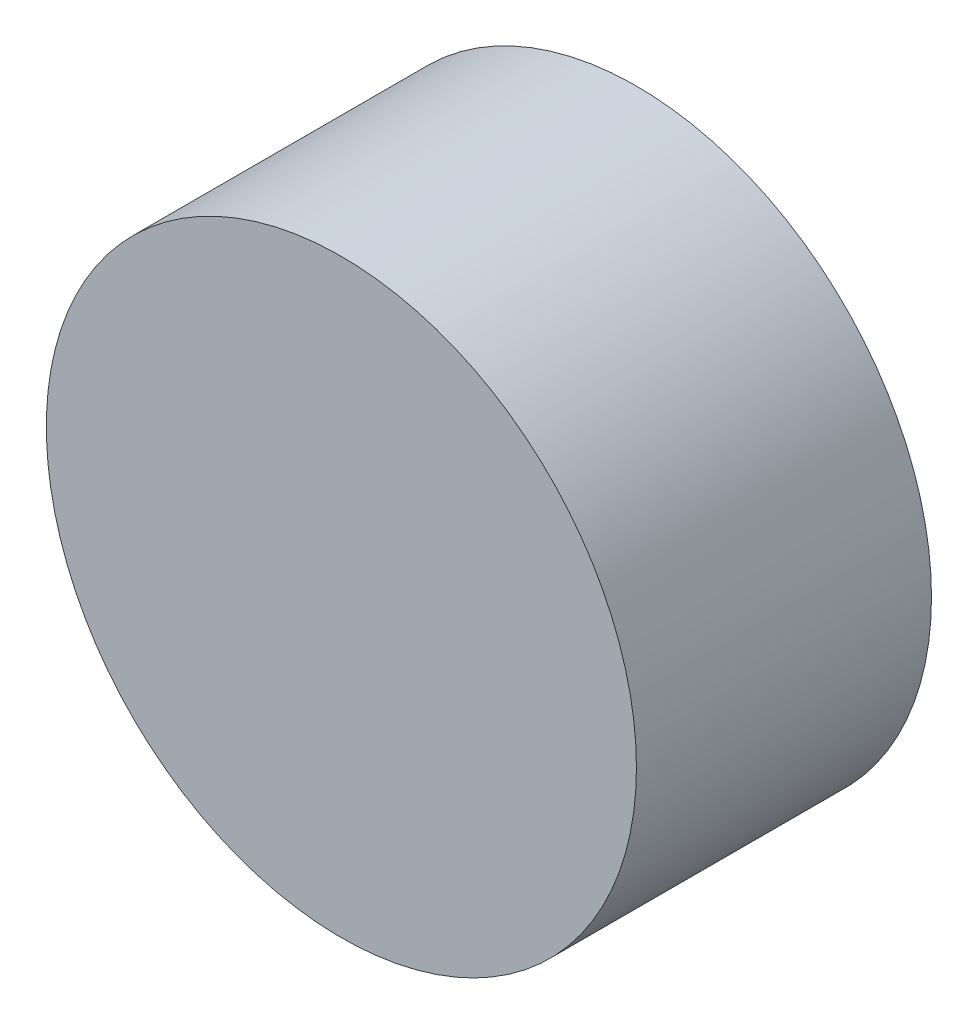
ISO-10303-21;
HEADER;
FILE_DESCRIPTION(('STEP AP214'),'2;1');
FILE_NAME('part.step','',(''),(''),'','','');
FILE_SCHEMA(('AUTOMOTIVE_DESIGN { 1 0 10303 214 1 1 1 1 }'));
ENDSEC;
DATA;
#1=APPLICATION_CONTEXT('core data for automotive mechanical design processes');
#2=APPLICATION_PROTOCOL_DEFINITION('international standard','automotive_design',2000,#1);
#3=PRODUCT_CONTEXT('',#1,'mechanical');
#4=PRODUCT('Part','Part','',(#3));
#5=PRODUCT_RELATED_PRODUCT_CATEGORY('part','',(#4));
#6=PRODUCT_DEFINITION_FORMATION('','',#4);
#7=PRODUCT_DEFINITION_CONTEXT('part definition',#1,'design');
#8=PRODUCT_DEFINITION('design','',#6,#7);
#9=PRODUCT_DEFINITION_SHAPE('','',#8);
#10=(LENGTH_UNIT() NAMED_UNIT(*) SI_UNIT(.MILLI.,.METRE.));
#11=(NAMED_UNIT(*) PLANE_ANGLE_UNIT() SI_UNIT($,.RADIAN.));
#12=(NAMED_UNIT(*) SI_UNIT($,.STERADIAN.) SOLID_ANGLE_UNIT());
#13=UNCERTAINTY_MEASURE_WITH_UNIT(LENGTH_MEASURE(1.E-05),#10,'distance_accuracy_value','');
#14=(GEOMETRIC_REPRESENTATION_CONTEXT(3) GLOBAL_UNCERTAINTY_ASSIGNED_CONTEXT((#13)) GLOBAL_UNIT_ASSIGNED_CONTEXT((#10,
#11,#12)) REPRESENTATION_CONTEXT('',''));
#15=CARTESIAN_POINT('',(0.,0.,0.));
#16=DIRECTION('',(0.,0.,1.));
#17=DIRECTION('',(1.,0.,0.));
#18=AXIS2_PLACEMENT_3D('',#15,#16,#17);
#19=CARTESIAN_POINT('',(0.,0.,3.));
#20=DIRECTION('',(0.,0.,-1.));
#21=DIRECTION('',(-1.,0.,0.));
#22=AXIS2_PLACEMENT_3D('',#19,#20,#21);
#23=CYLINDRICAL_SURFACE('',#22,3.);
#24=CARTESIAN_POINT('',(0.,0.,3.));
#25=DIRECTION('',(0.,0.,1.));
#26=DIRECTION('',(1.,0.,0.));
#27=AXIS2_PLACEMENT_3D('',#24,#25,#26);
#28=CIRCLE('',#27,3.);
#29=CARTESIAN_POINT('',(3.,0.,3.));
#30=VERTEX_POINT('',#29);
#31=EDGE_CURVE('E10',#30,#30,#28,.T.);
#32=ORIENTED_EDGE('',*,*,#31,.F.);
#33=EDGE_LOOP('',(#32));
#34=FACE_BOUND('',#33,.T.);
#35=CARTESIAN_POINT('',(0.,0.,0.));
#36=DIRECTION('',(0.,0.,1.));
#37=DIRECTION('',(1.,0.,0.));
#38=AXIS2_PLACEMENT_3D('',#35,#36,#37);
#39=CIRCLE('',#38,3.);
#40=CARTESIAN_POINT('',(3.,0.,0.));
#41=VERTEX_POINT('',#40);
#42=EDGE_CURVE('E34',#41,#41,#39,.T.);
#43=ORIENTED_EDGE('',*,*,#42,.T.);
#44=EDGE_LOOP('',(#43));
#45=FACE_BOUND('',#44,.T.);
#46=ADVANCED_FACE('F31',(#34,#45),#23,.T.);
#47=CARTESIAN_POINT('',(0.,0.,3.));
#48=DIRECTION('',(0.,0.,1.));
#49=DIRECTION('',(1.,0.,0.));
#50=AXIS2_PLACEMENT_3D('',#47,#48,#49);
#51=PLANE('',#50);
#52=ORIENTED_EDGE('',*,*,#31,.T.);
#53=EDGE_LOOP('',(#52));
#54=FACE_BOUND('',#53,.T.);
#55=ADVANCED_FACE('F46',(#54),#51,.T.);
#56=CARTESIAN_POINT('',(0.,0.,0.));
#57=DIRECTION('',(0.,0.,1.));
#58=DIRECTION('',(1.,0.,0.));
#59=AXIS2_PLACEMENT_3D('',#56,#57,#58);
#60=PLANE('',#59);
#61=ORIENTED_EDGE('',*,*,#42,.F.);
#62=EDGE_LOOP('',(#61));
#63=FACE_BOUND('',#62,.T.);
#64=ADVANCED_FACE('F44',(#63),#60,.F.);
#65=CLOSED_SHELL('',(#46,#55,#64));
#66=MANIFOLD_SOLID_BREP('B2',#65);
#67=ADVANCED_BREP_SHAPE_REPRESENTATION('',(#18,#66),#14);
#68=SHAPE_DEFINITION_REPRESENTATION(#9,#67);
ENDSEC;
END-ISO-10303-21;
